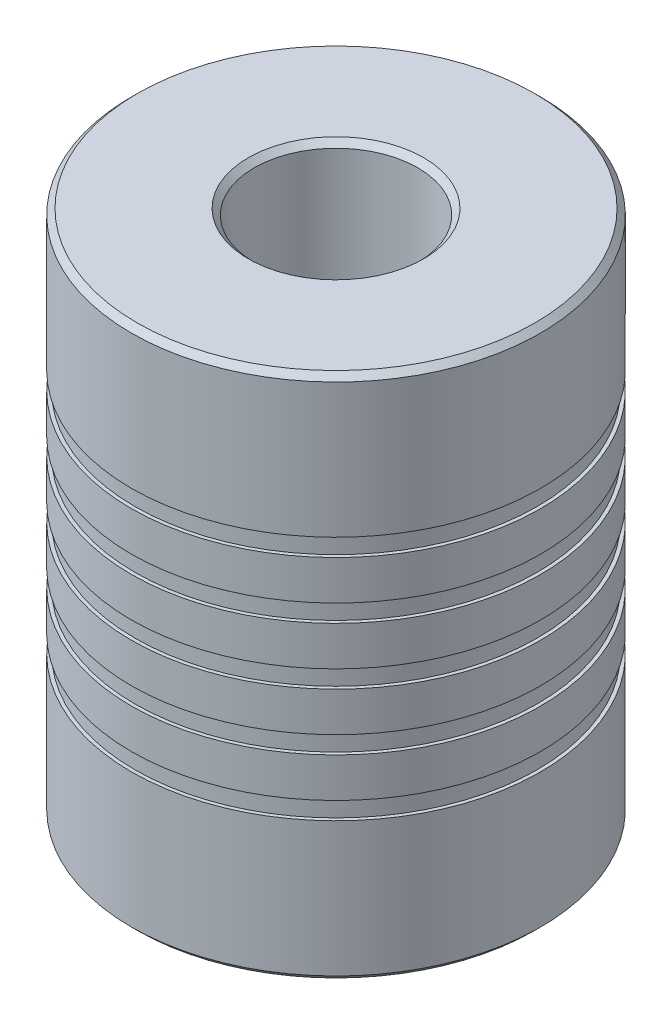
ISO-10303-21;
HEADER;
FILE_DESCRIPTION(('STEP AP214'),'2;1');
FILE_NAME('part.step','',(''),(''),'','','');
FILE_SCHEMA(('AUTOMOTIVE_DESIGN { 1 0 10303 214 1 1 1 1 }'));
ENDSEC;
DATA;
#1=APPLICATION_CONTEXT('core data for automotive mechanical design processes');
#2=APPLICATION_PROTOCOL_DEFINITION('international standard','automotive_design',2000,#1);
#3=PRODUCT_CONTEXT('',#1,'mechanical');
#4=PRODUCT('Part','Part','',(#3));
#5=PRODUCT_RELATED_PRODUCT_CATEGORY('part','',(#4));
#6=PRODUCT_DEFINITION_FORMATION('','',#4);
#7=PRODUCT_DEFINITION_CONTEXT('part definition',#1,'design');
#8=PRODUCT_DEFINITION('design','',#6,#7);
#9=PRODUCT_DEFINITION_SHAPE('','',#8);
#10=(LENGTH_UNIT() NAMED_UNIT(*) SI_UNIT(.MILLI.,.METRE.));
#11=(NAMED_UNIT(*) PLANE_ANGLE_UNIT() SI_UNIT($,.RADIAN.));
#12=(NAMED_UNIT(*) SI_UNIT($,.STERADIAN.) SOLID_ANGLE_UNIT());
#13=UNCERTAINTY_MEASURE_WITH_UNIT(LENGTH_MEASURE(1.E-05),#10,'distance_accuracy_value','');
#14=(GEOMETRIC_REPRESENTATION_CONTEXT(3) GLOBAL_UNCERTAINTY_ASSIGNED_CONTEXT((#13)) GLOBAL_UNIT_ASSIGNED_CONTEXT((#10,
#11,#12)) REPRESENTATION_CONTEXT('',''));
#15=CARTESIAN_POINT('',(0.,0.,0.));
#16=DIRECTION('',(0.,0.,1.));
#17=DIRECTION('',(1.,0.,0.));
#18=AXIS2_PLACEMENT_3D('',#15,#16,#17);
#19=CARTESIAN_POINT('',(0.,53.6510347798851,0.));
#20=DIRECTION('',(0.,1.,0.));
#21=DIRECTION('',(0.,0.,1.));
#22=AXIS2_PLACEMENT_3D('',#19,#20,#21);
#23=CYLINDRICAL_SURFACE('',#22,7.);
#24=CARTESIAN_POINT('',(0.,-22.,0.));
#25=DIRECTION('',(0.,1.,0.));
#26=DIRECTION('',(0.,0.,1.));
#27=AXIS2_PLACEMENT_3D('',#24,#25,#26);
#28=CIRCLE('',#27,7.);
#29=CARTESIAN_POINT('',(0.,-22.,7.));
#30=VERTEX_POINT('',#29);
#31=EDGE_CURVE('E65',#30,#30,#28,.F.);
#32=ORIENTED_EDGE('',*,*,#31,.T.);
#33=EDGE_LOOP('',(#32));
#34=FACE_BOUND('',#33,.T.);
#35=CARTESIAN_POINT('',(2.22044604925031E-13,22.,0.));
#36=DIRECTION('',(0.,-1.,0.));
#37=DIRECTION('',(0.,0.,-1.));
#38=AXIS2_PLACEMENT_3D('',#35,#36,#37);
#39=CIRCLE('',#38,7.);
#40=CARTESIAN_POINT('',(2.21656026866413E-13,22.,-7.));
#41=VERTEX_POINT('',#40);
#42=EDGE_CURVE('E68',#41,#41,#39,.F.);
#43=ORIENTED_EDGE('',*,*,#42,.T.);
#44=EDGE_LOOP('',(#43));
#45=FACE_BOUND('',#44,.T.);
#46=ADVANCED_FACE('F45',(#34,#45),#23,.F.);
#47=CARTESIAN_POINT('',(-7.00000000000001,-22.5,0.));
#48=DIRECTION('',(0.,1.,0.));
#49=DIRECTION('',(0.,0.,1.));
#50=AXIS2_PLACEMENT_3D('',#47,#48,#49);
#51=PLANE('',#50);
#52=CARTESIAN_POINT('',(0.,-22.5,0.));
#53=DIRECTION('',(0.,1.,0.));
#54=DIRECTION('',(0.,0.,1.));
#55=AXIS2_PLACEMENT_3D('',#52,#53,#54);
#56=CIRCLE('',#55,7.50000000000002);
#57=CARTESIAN_POINT('',(0.,-22.5,7.50000000000002));
#58=VERTEX_POINT('',#57);
#59=EDGE_CURVE('E71',#58,#58,#56,.T.);
#60=ORIENTED_EDGE('',*,*,#59,.T.);
#61=EDGE_LOOP('',(#60));
#62=FACE_BOUND('',#61,.T.);
#63=CARTESIAN_POINT('',(0.,-22.5,0.));
#64=DIRECTION('',(0.,1.,0.));
#65=DIRECTION('',(0.,0.,1.));
#66=AXIS2_PLACEMENT_3D('',#63,#64,#65);
#67=CIRCLE('',#66,17.);
#68=CARTESIAN_POINT('',(0.,-22.5,17.));
#69=VERTEX_POINT('',#68);
#70=EDGE_CURVE('E74',#69,#69,#67,.F.);
#71=ORIENTED_EDGE('',*,*,#70,.T.);
#72=EDGE_LOOP('',(#71));
#73=FACE_BOUND('',#72,.T.);
#74=ADVANCED_FACE('F256',(#62,#73),#51,.F.);
#75=CARTESIAN_POINT('',(0.,53.6510347798851,0.));
#76=DIRECTION('',(0.,1.,0.));
#77=DIRECTION('',(0.,0.,1.));
#78=AXIS2_PLACEMENT_3D('',#75,#76,#77);
#79=CYLINDRICAL_SURFACE('',#78,17.5);
#80=CARTESIAN_POINT('',(0.,-22.,0.));
#81=DIRECTION('',(0.,1.,0.));
#82=DIRECTION('',(0.,0.,1.));
#83=AXIS2_PLACEMENT_3D('',#80,#81,#82);
#84=CIRCLE('',#83,17.5);
#85=CARTESIAN_POINT('',(0.,-22.,17.5));
#86=VERTEX_POINT('',#85);
#87=EDGE_CURVE('E60',#86,#86,#84,.T.);
#88=ORIENTED_EDGE('',*,*,#87,.T.);
#89=EDGE_LOOP('',(#88));
#90=FACE_BOUND('',#89,.T.);
#91=CARTESIAN_POINT('',(0.,-10.5,0.));
#92=DIRECTION('',(0.,1.,0.));
#93=DIRECTION('',(0.,0.,1.));
#94=AXIS2_PLACEMENT_3D('',#91,#92,#93);
#95=CIRCLE('',#94,17.5);
#96=CARTESIAN_POINT('',(0.,-10.5,17.5));
#97=VERTEX_POINT('',#96);
#98=EDGE_CURVE('E77',#97,#97,#95,.T.);
#99=ORIENTED_EDGE('',*,*,#98,.F.);
#100=EDGE_LOOP('',(#99));
#101=FACE_BOUND('',#100,.T.);
#102=ADVANCED_FACE('F251',(#90,#101),#79,.T.);
#103=CARTESIAN_POINT('',(-17.5000000000002,-10.5,1.94289029309402E-13));
#104=DIRECTION('',(0.,-1.,0.));
#105=DIRECTION('',(0.,0.,-1.));
#106=AXIS2_PLACEMENT_3D('',#103,#104,#105);
#107=PLANE('',#106);
#108=CARTESIAN_POINT('',(0.,-10.5,0.));
#109=DIRECTION('',(0.,1.,0.));
#110=DIRECTION('',(0.,0.,1.));
#111=AXIS2_PLACEMENT_3D('',#108,#109,#110);
#112=CIRCLE('',#111,17.2);
#113=CARTESIAN_POINT('',(0.,-10.5,17.2));
#114=VERTEX_POINT('',#113);
#115=EDGE_CURVE('E80',#114,#114,#112,.T.);
#116=ORIENTED_EDGE('',*,*,#115,.F.);
#117=EDGE_LOOP('',(#116));
#118=FACE_BOUND('',#117,.T.);
#119=ORIENTED_EDGE('',*,*,#98,.T.);
#120=EDGE_LOOP('',(#119));
#121=FACE_BOUND('',#120,.T.);
#122=ADVANCED_FACE('F245',(#118,#121),#107,.F.);
#123=CARTESIAN_POINT('',(0.,53.6510347798851,0.));
#124=DIRECTION('',(0.,1.,0.));
#125=DIRECTION('',(0.,0.,1.));
#126=AXIS2_PLACEMENT_3D('',#123,#124,#125);
#127=CYLINDRICAL_SURFACE('',#126,17.2);
#128=CARTESIAN_POINT('',(0.,-9.00000000000001,0.));
#129=DIRECTION('',(0.,1.,0.));
#130=DIRECTION('',(0.,0.,1.));
#131=AXIS2_PLACEMENT_3D('',#128,#129,#130);
#132=CIRCLE('',#131,17.2);
#133=CARTESIAN_POINT('',(0.,-9.00000000000001,17.2));
#134=VERTEX_POINT('',#133);
#135=EDGE_CURVE('E83',#134,#134,#132,.T.);
#136=ORIENTED_EDGE('',*,*,#135,.F.);
#137=EDGE_LOOP('',(#136));
#138=FACE_BOUND('',#137,.T.);
#139=ORIENTED_EDGE('',*,*,#115,.T.);
#140=EDGE_LOOP('',(#139));
#141=FACE_BOUND('',#140,.T.);
#142=ADVANCED_FACE('F239',(#138,#141),#127,.T.);
#143=CARTESIAN_POINT('',(-17.2,-8.9999999999999,1.11022302462516E-13));
#144=DIRECTION('',(0.,1.,0.));
#145=DIRECTION('',(0.,0.,1.));
#146=AXIS2_PLACEMENT_3D('',#143,#144,#145);
#147=PLANE('',#146);
#148=CARTESIAN_POINT('',(0.,-9.00000000000001,0.));
#149=DIRECTION('',(0.,1.,0.));
#150=DIRECTION('',(0.,0.,1.));
#151=AXIS2_PLACEMENT_3D('',#148,#149,#150);
#152=CIRCLE('',#151,17.5);
#153=CARTESIAN_POINT('',(0.,-9.00000000000001,17.5));
#154=VERTEX_POINT('',#153);
#155=EDGE_CURVE('E86',#154,#154,#152,.T.);
#156=ORIENTED_EDGE('',*,*,#155,.F.);
#157=EDGE_LOOP('',(#156));
#158=FACE_BOUND('',#157,.T.);
#159=ORIENTED_EDGE('',*,*,#135,.T.);
#160=EDGE_LOOP('',(#159));
#161=FACE_BOUND('',#160,.T.);
#162=ADVANCED_FACE('F233',(#158,#161),#147,.F.);
#163=CARTESIAN_POINT('',(0.,53.6510347798851,0.));
#164=DIRECTION('',(0.,1.,0.));
#165=DIRECTION('',(0.,0.,1.));
#166=AXIS2_PLACEMENT_3D('',#163,#164,#165);
#167=CYLINDRICAL_SURFACE('',#166,17.5);
#168=CARTESIAN_POINT('',(0.,-5.62499999999999,0.));
#169=DIRECTION('',(0.,1.,0.));
#170=DIRECTION('',(0.,0.,1.));
#171=AXIS2_PLACEMENT_3D('',#168,#169,#170);
#172=CIRCLE('',#171,17.5);
#173=CARTESIAN_POINT('',(0.,-5.62499999999999,17.5));
#174=VERTEX_POINT('',#173);
#175=EDGE_CURVE('E89',#174,#174,#172,.T.);
#176=ORIENTED_EDGE('',*,*,#175,.F.);
#177=EDGE_LOOP('',(#176));
#178=FACE_BOUND('',#177,.T.);
#179=ORIENTED_EDGE('',*,*,#155,.T.);
#180=EDGE_LOOP('',(#179));
#181=FACE_BOUND('',#180,.T.);
#182=ADVANCED_FACE('F227',(#178,#181),#167,.T.);
#183=CARTESIAN_POINT('',(-17.5000000000002,-5.62499999999999,1.11022302462516E-13));
#184=DIRECTION('',(0.,-1.,0.));
#185=DIRECTION('',(0.,0.,-1.));
#186=AXIS2_PLACEMENT_3D('',#183,#184,#185);
#187=PLANE('',#186);
#188=CARTESIAN_POINT('',(0.,-5.62499999999999,0.));
#189=DIRECTION('',(0.,1.,0.));
#190=DIRECTION('',(0.,0.,1.));
#191=AXIS2_PLACEMENT_3D('',#188,#189,#190);
#192=CIRCLE('',#191,17.2);
#193=CARTESIAN_POINT('',(0.,-5.62499999999999,17.2));
#194=VERTEX_POINT('',#193);
#195=EDGE_CURVE('E92',#194,#194,#192,.T.);
#196=ORIENTED_EDGE('',*,*,#195,.F.);
#197=EDGE_LOOP('',(#196));
#198=FACE_BOUND('',#197,.T.);
#199=ORIENTED_EDGE('',*,*,#175,.T.);
#200=EDGE_LOOP('',(#199));
#201=FACE_BOUND('',#200,.T.);
#202=ADVANCED_FACE('F221',(#198,#201),#187,.F.);
#203=CARTESIAN_POINT('',(0.,53.6510347798851,0.));
#204=DIRECTION('',(0.,1.,0.));
#205=DIRECTION('',(0.,0.,1.));
#206=AXIS2_PLACEMENT_3D('',#203,#204,#205);
#207=CYLINDRICAL_SURFACE('',#206,17.2);
#208=CARTESIAN_POINT('',(0.,-4.12499999999993,0.));
#209=DIRECTION('',(0.,1.,0.));
#210=DIRECTION('',(0.,0.,1.));
#211=AXIS2_PLACEMENT_3D('',#208,#209,#210);
#212=CIRCLE('',#211,17.2);
#213=CARTESIAN_POINT('',(0.,-4.12499999999993,17.2));
#214=VERTEX_POINT('',#213);
#215=EDGE_CURVE('E95',#214,#214,#212,.T.);
#216=ORIENTED_EDGE('',*,*,#215,.F.);
#217=EDGE_LOOP('',(#216));
#218=FACE_BOUND('',#217,.T.);
#219=ORIENTED_EDGE('',*,*,#195,.T.);
#220=EDGE_LOOP('',(#219));
#221=FACE_BOUND('',#220,.T.);
#222=ADVANCED_FACE('F215',(#218,#221),#207,.T.);
#223=CARTESIAN_POINT('',(-17.2,-4.12500000000005,1.11022302462516E-13));
#224=DIRECTION('',(0.,1.,0.));
#225=DIRECTION('',(0.,0.,1.));
#226=AXIS2_PLACEMENT_3D('',#223,#224,#225);
#227=PLANE('',#226);
#228=CARTESIAN_POINT('',(0.,-4.12499999999993,0.));
#229=DIRECTION('',(0.,1.,0.));
#230=DIRECTION('',(0.,0.,1.));
#231=AXIS2_PLACEMENT_3D('',#228,#229,#230);
#232=CIRCLE('',#231,17.5);
#233=CARTESIAN_POINT('',(0.,-4.12499999999993,17.5));
#234=VERTEX_POINT('',#233);
#235=EDGE_CURVE('E98',#234,#234,#232,.T.);
#236=ORIENTED_EDGE('',*,*,#235,.F.);
#237=EDGE_LOOP('',(#236));
#238=FACE_BOUND('',#237,.T.);
#239=ORIENTED_EDGE('',*,*,#215,.T.);
#240=EDGE_LOOP('',(#239));
#241=FACE_BOUND('',#240,.T.);
#242=ADVANCED_FACE('F209',(#238,#241),#227,.F.);
#243=CARTESIAN_POINT('',(0.,53.6510347798851,0.));
#244=DIRECTION('',(0.,1.,0.));
#245=DIRECTION('',(0.,0.,1.));
#246=AXIS2_PLACEMENT_3D('',#243,#244,#245);
#247=CYLINDRICAL_SURFACE('',#246,17.5);
#248=CARTESIAN_POINT('',(0.,-0.750000000000028,0.));
#249=DIRECTION('',(0.,1.,0.));
#250=DIRECTION('',(0.,0.,1.));
#251=AXIS2_PLACEMENT_3D('',#248,#249,#250);
#252=CIRCLE('',#251,17.5);
#253=CARTESIAN_POINT('',(0.,-0.750000000000028,17.5));
#254=VERTEX_POINT('',#253);
#255=EDGE_CURVE('E101',#254,#254,#252,.T.);
#256=ORIENTED_EDGE('',*,*,#255,.F.);
#257=EDGE_LOOP('',(#256));
#258=FACE_BOUND('',#257,.T.);
#259=ORIENTED_EDGE('',*,*,#235,.T.);
#260=EDGE_LOOP('',(#259));
#261=FACE_BOUND('',#260,.T.);
#262=ADVANCED_FACE('F203',(#258,#261),#247,.T.);
#263=CARTESIAN_POINT('',(-17.5000000000002,-0.750000000000028,1.94289029309402E-13));
#264=DIRECTION('',(0.,-1.,0.));
#265=DIRECTION('',(0.,0.,-1.));
#266=AXIS2_PLACEMENT_3D('',#263,#264,#265);
#267=PLANE('',#266);
#268=CARTESIAN_POINT('',(0.,-0.750000000000028,0.));
#269=DIRECTION('',(0.,1.,0.));
#270=DIRECTION('',(0.,0.,1.));
#271=AXIS2_PLACEMENT_3D('',#268,#269,#270);
#272=CIRCLE('',#271,17.2);
#273=CARTESIAN_POINT('',(0.,-0.750000000000028,17.2));
#274=VERTEX_POINT('',#273);
#275=EDGE_CURVE('E104',#274,#274,#272,.T.);
#276=ORIENTED_EDGE('',*,*,#275,.F.);
#277=EDGE_LOOP('',(#276));
#278=FACE_BOUND('',#277,.T.);
#279=ORIENTED_EDGE('',*,*,#255,.T.);
#280=EDGE_LOOP('',(#279));
#281=FACE_BOUND('',#280,.T.);
#282=ADVANCED_FACE('F197',(#278,#281),#267,.F.);
#283=CARTESIAN_POINT('',(0.,53.6510347798851,0.));
#284=DIRECTION('',(0.,1.,0.));
#285=DIRECTION('',(0.,0.,1.));
#286=AXIS2_PLACEMENT_3D('',#283,#284,#285);
#287=CYLINDRICAL_SURFACE('',#286,17.2);
#288=CARTESIAN_POINT('',(0.,0.750000000000028,0.));
#289=DIRECTION('',(0.,1.,0.));
#290=DIRECTION('',(0.,0.,1.));
#291=AXIS2_PLACEMENT_3D('',#288,#289,#290);
#292=CIRCLE('',#291,17.2);
#293=CARTESIAN_POINT('',(0.,0.750000000000029,17.2));
#294=VERTEX_POINT('',#293);
#295=EDGE_CURVE('E107',#294,#294,#292,.T.);
#296=ORIENTED_EDGE('',*,*,#295,.F.);
#297=EDGE_LOOP('',(#296));
#298=FACE_BOUND('',#297,.T.);
#299=ORIENTED_EDGE('',*,*,#275,.T.);
#300=EDGE_LOOP('',(#299));
#301=FACE_BOUND('',#300,.T.);
#302=ADVANCED_FACE('F191',(#298,#301),#287,.T.);
#303=CARTESIAN_POINT('',(-17.5000000000002,0.750000000000028,1.11022302462516E-13));
#304=DIRECTION('',(0.,1.,0.));
#305=DIRECTION('',(0.,0.,1.));
#306=AXIS2_PLACEMENT_3D('',#303,#304,#305);
#307=PLANE('',#306);
#308=CARTESIAN_POINT('',(0.,0.750000000000028,0.));
#309=DIRECTION('',(0.,1.,0.));
#310=DIRECTION('',(0.,0.,1.));
#311=AXIS2_PLACEMENT_3D('',#308,#309,#310);
#312=CIRCLE('',#311,17.5);
#313=CARTESIAN_POINT('',(0.,0.750000000000029,17.5));
#314=VERTEX_POINT('',#313);
#315=EDGE_CURVE('E110',#314,#314,#312,.T.);
#316=ORIENTED_EDGE('',*,*,#315,.F.);
#317=EDGE_LOOP('',(#316));
#318=FACE_BOUND('',#317,.T.);
#319=ORIENTED_EDGE('',*,*,#295,.T.);
#320=EDGE_LOOP('',(#319));
#321=FACE_BOUND('',#320,.T.);
#322=ADVANCED_FACE('F185',(#318,#321),#307,.F.);
#323=CARTESIAN_POINT('',(0.,53.6510347798851,0.));
#324=DIRECTION('',(0.,1.,0.));
#325=DIRECTION('',(0.,0.,1.));
#326=AXIS2_PLACEMENT_3D('',#323,#324,#325);
#327=CYLINDRICAL_SURFACE('',#326,17.5);
#328=CARTESIAN_POINT('',(2.22044604925031E-13,4.12500000000005,0.));
#329=DIRECTION('',(0.,1.,0.));
#330=DIRECTION('',(0.,0.,1.));
#331=AXIS2_PLACEMENT_3D('',#328,#329,#330);
#332=CIRCLE('',#331,17.5);
#333=CARTESIAN_POINT('',(2.23016050071578E-13,4.12500000000005,17.5));
#334=VERTEX_POINT('',#333);
#335=EDGE_CURVE('E113',#334,#334,#332,.T.);
#336=ORIENTED_EDGE('',*,*,#335,.F.);
#337=EDGE_LOOP('',(#336));
#338=FACE_BOUND('',#337,.T.);
#339=ORIENTED_EDGE('',*,*,#315,.T.);
#340=EDGE_LOOP('',(#339));
#341=FACE_BOUND('',#340,.T.);
#342=ADVANCED_FACE('F179',(#338,#341),#327,.T.);
#343=CARTESIAN_POINT('',(-17.1999999999999,4.12499999999993,2.22044604925031E-13));
#344=DIRECTION('',(0.,-1.,0.));
#345=DIRECTION('',(0.,0.,-1.));
#346=AXIS2_PLACEMENT_3D('',#343,#344,#345);
#347=PLANE('',#346);
#348=CARTESIAN_POINT('',(2.22044604925031E-13,4.12500000000005,0.));
#349=DIRECTION('',(0.,1.,0.));
#350=DIRECTION('',(0.,0.,1.));
#351=AXIS2_PLACEMENT_3D('',#348,#349,#350);
#352=CIRCLE('',#351,17.2);
#353=CARTESIAN_POINT('',(2.22999396726209E-13,4.12500000000005,17.2));
#354=VERTEX_POINT('',#353);
#355=EDGE_CURVE('E116',#354,#354,#352,.T.);
#356=ORIENTED_EDGE('',*,*,#355,.F.);
#357=EDGE_LOOP('',(#356));
#358=FACE_BOUND('',#357,.T.);
#359=ORIENTED_EDGE('',*,*,#335,.T.);
#360=EDGE_LOOP('',(#359));
#361=FACE_BOUND('',#360,.T.);
#362=ADVANCED_FACE('F173',(#358,#361),#347,.F.);
#363=CARTESIAN_POINT('',(0.,53.6510347798851,0.));
#364=DIRECTION('',(0.,1.,0.));
#365=DIRECTION('',(0.,0.,1.));
#366=AXIS2_PLACEMENT_3D('',#363,#364,#365);
#367=CYLINDRICAL_SURFACE('',#366,17.2);
#368=CARTESIAN_POINT('',(2.22044604925031E-13,5.62499999999999,0.));
#369=DIRECTION('',(0.,1.,0.));
#370=DIRECTION('',(0.,0.,1.));
#371=AXIS2_PLACEMENT_3D('',#368,#369,#370);
#372=CIRCLE('',#371,17.2);
#373=CARTESIAN_POINT('',(2.22999396726209E-13,5.62499999999999,17.2));
#374=VERTEX_POINT('',#373);
#375=EDGE_CURVE('E119',#374,#374,#372,.T.);
#376=ORIENTED_EDGE('',*,*,#375,.F.);
#377=EDGE_LOOP('',(#376));
#378=FACE_BOUND('',#377,.T.);
#379=ORIENTED_EDGE('',*,*,#355,.T.);
#380=EDGE_LOOP('',(#379));
#381=FACE_BOUND('',#380,.T.);
#382=ADVANCED_FACE('F167',(#378,#381),#367,.T.);
#383=CARTESIAN_POINT('',(-17.5,5.62499999999999,1.38777878078145E-13));
#384=DIRECTION('',(0.,1.,0.));
#385=DIRECTION('',(0.,0.,1.));
#386=AXIS2_PLACEMENT_3D('',#383,#384,#385);
#387=PLANE('',#386);
#388=CARTESIAN_POINT('',(2.22044604925031E-13,5.62499999999999,0.));
#389=DIRECTION('',(0.,1.,0.));
#390=DIRECTION('',(0.,0.,1.));
#391=AXIS2_PLACEMENT_3D('',#388,#389,#390);
#392=CIRCLE('',#391,17.5);
#393=CARTESIAN_POINT('',(2.23016050071578E-13,5.62499999999999,17.5));
#394=VERTEX_POINT('',#393);
#395=EDGE_CURVE('E122',#394,#394,#392,.T.);
#396=ORIENTED_EDGE('',*,*,#395,.F.);
#397=EDGE_LOOP('',(#396));
#398=FACE_BOUND('',#397,.T.);
#399=ORIENTED_EDGE('',*,*,#375,.T.);
#400=EDGE_LOOP('',(#399));
#401=FACE_BOUND('',#400,.T.);
#402=ADVANCED_FACE('F161',(#398,#401),#387,.F.);
#403=CARTESIAN_POINT('',(0.,53.6510347798851,0.));
#404=DIRECTION('',(0.,1.,0.));
#405=DIRECTION('',(0.,0.,1.));
#406=AXIS2_PLACEMENT_3D('',#403,#404,#405);
#407=CYLINDRICAL_SURFACE('',#406,17.5);
#408=CARTESIAN_POINT('',(2.22044604925031E-13,9.00000000000001,0.));
#409=DIRECTION('',(0.,1.,0.));
#410=DIRECTION('',(0.,0.,1.));
#411=AXIS2_PLACEMENT_3D('',#408,#409,#410);
#412=CIRCLE('',#411,17.5);
#413=CARTESIAN_POINT('',(2.23016050071578E-13,9.00000000000001,17.5));
#414=VERTEX_POINT('',#413);
#415=EDGE_CURVE('E125',#414,#414,#412,.T.);
#416=ORIENTED_EDGE('',*,*,#415,.F.);
#417=EDGE_LOOP('',(#416));
#418=FACE_BOUND('',#417,.T.);
#419=ORIENTED_EDGE('',*,*,#395,.T.);
#420=EDGE_LOOP('',(#419));
#421=FACE_BOUND('',#420,.T.);
#422=ADVANCED_FACE('F155',(#418,#421),#407,.T.);
#423=CARTESIAN_POINT('',(-17.2,9.00000000000001,1.11022302462516E-13));
#424=DIRECTION('',(0.,-1.,0.));
#425=DIRECTION('',(0.,0.,-1.));
#426=AXIS2_PLACEMENT_3D('',#423,#424,#425);
#427=PLANE('',#426);
#428=CARTESIAN_POINT('',(2.22044604925031E-13,9.00000000000001,0.));
#429=DIRECTION('',(0.,1.,0.));
#430=DIRECTION('',(0.,0.,1.));
#431=AXIS2_PLACEMENT_3D('',#428,#429,#430);
#432=CIRCLE('',#431,17.2);
#433=CARTESIAN_POINT('',(2.22999396726209E-13,9.00000000000001,17.2));
#434=VERTEX_POINT('',#433);
#435=EDGE_CURVE('E128',#434,#434,#432,.T.);
#436=ORIENTED_EDGE('',*,*,#435,.F.);
#437=EDGE_LOOP('',(#436));
#438=FACE_BOUND('',#437,.T.);
#439=ORIENTED_EDGE('',*,*,#415,.T.);
#440=EDGE_LOOP('',(#439));
#441=FACE_BOUND('',#440,.T.);
#442=ADVANCED_FACE('F149',(#438,#441),#427,.F.);
#443=CARTESIAN_POINT('',(0.,53.6510347798851,0.));
#444=DIRECTION('',(0.,1.,0.));
#445=DIRECTION('',(0.,0.,1.));
#446=AXIS2_PLACEMENT_3D('',#443,#444,#445);
#447=CYLINDRICAL_SURFACE('',#446,17.2);
#448=CARTESIAN_POINT('',(2.23779328401008E-13,10.5,0.));
#449=DIRECTION('',(0.,1.,0.));
#450=DIRECTION('',(0.,0.,1.));
#451=AXIS2_PLACEMENT_3D('',#448,#449,#450);
#452=CIRCLE('',#451,17.2);
#453=CARTESIAN_POINT('',(2.24734120202186E-13,10.5,17.2));
#454=VERTEX_POINT('',#453);
#455=EDGE_CURVE('E131',#454,#454,#452,.T.);
#456=ORIENTED_EDGE('',*,*,#455,.F.);
#457=EDGE_LOOP('',(#456));
#458=FACE_BOUND('',#457,.T.);
#459=ORIENTED_EDGE('',*,*,#435,.T.);
#460=EDGE_LOOP('',(#459));
#461=FACE_BOUND('',#460,.T.);
#462=ADVANCED_FACE('F143',(#458,#461),#447,.T.);
#463=CARTESIAN_POINT('',(-17.5,10.5,1.11022302462516E-13));
#464=DIRECTION('',(0.,1.,0.));
#465=DIRECTION('',(0.,0.,1.));
#466=AXIS2_PLACEMENT_3D('',#463,#464,#465);
#467=PLANE('',#466);
#468=CARTESIAN_POINT('',(2.23779328401008E-13,10.5,0.));
#469=DIRECTION('',(0.,1.,0.));
#470=DIRECTION('',(0.,0.,1.));
#471=AXIS2_PLACEMENT_3D('',#468,#469,#470);
#472=CIRCLE('',#471,17.5);
#473=CARTESIAN_POINT('',(2.24750773547555E-13,10.5,17.5));
#474=VERTEX_POINT('',#473);
#475=EDGE_CURVE('E134',#474,#474,#472,.T.);
#476=ORIENTED_EDGE('',*,*,#475,.F.);
#477=EDGE_LOOP('',(#476));
#478=FACE_BOUND('',#477,.T.);
#479=ORIENTED_EDGE('',*,*,#455,.T.);
#480=EDGE_LOOP('',(#479));
#481=FACE_BOUND('',#480,.T.);
#482=ADVANCED_FACE('F140',(#478,#481),#467,.F.);
#483=CARTESIAN_POINT('',(0.,53.6510347798851,0.));
#484=DIRECTION('',(0.,1.,0.));
#485=DIRECTION('',(0.,0.,1.));
#486=AXIS2_PLACEMENT_3D('',#483,#484,#485);
#487=CYLINDRICAL_SURFACE('',#486,17.5);
#488=CARTESIAN_POINT('',(2.22044604925031E-13,22.,0.));
#489=DIRECTION('',(0.,-1.,0.));
#490=DIRECTION('',(0.,0.,-1.));
#491=AXIS2_PLACEMENT_3D('',#488,#489,#490);
#492=CIRCLE('',#491,17.5);
#493=CARTESIAN_POINT('',(2.21073159778484E-13,22.,-17.5));
#494=VERTEX_POINT('',#493);
#495=EDGE_CURVE('E12',#494,#494,#492,.T.);
#496=ORIENTED_EDGE('',*,*,#495,.T.);
#497=EDGE_LOOP('',(#496));
#498=FACE_BOUND('',#497,.T.);
#499=ORIENTED_EDGE('',*,*,#475,.T.);
#500=EDGE_LOOP('',(#499));
#501=FACE_BOUND('',#500,.T.);
#502=ADVANCED_FACE('F138',(#498,#501),#487,.T.);
#503=CARTESIAN_POINT('',(-7.00000000000001,22.5,0.));
#504=DIRECTION('',(0.,-1.,0.));
#505=DIRECTION('',(0.,0.,-1.));
#506=AXIS2_PLACEMENT_3D('',#503,#504,#505);
#507=PLANE('',#506);
#508=CARTESIAN_POINT('',(2.22044604925031E-13,22.5,0.));
#509=DIRECTION('',(0.,-1.,0.));
#510=DIRECTION('',(0.,0.,-1.));
#511=AXIS2_PLACEMENT_3D('',#508,#509,#510);
#512=CIRCLE('',#511,7.50000000000003);
#513=CARTESIAN_POINT('',(2.21628271290797E-13,22.5,-7.50000000000003));
#514=VERTEX_POINT('',#513);
#515=EDGE_CURVE('E52',#514,#514,#512,.T.);
#516=ORIENTED_EDGE('',*,*,#515,.T.);
#517=EDGE_LOOP('',(#516));
#518=FACE_BOUND('',#517,.T.);
#519=CARTESIAN_POINT('',(2.22044604925031E-13,22.5,0.));
#520=DIRECTION('',(0.,-1.,0.));
#521=DIRECTION('',(0.,0.,-1.));
#522=AXIS2_PLACEMENT_3D('',#519,#520,#521);
#523=CIRCLE('',#522,17.);
#524=CARTESIAN_POINT('',(2.211009153541E-13,22.5,-17.));
#525=VERTEX_POINT('',#524);
#526=EDGE_CURVE('E56',#525,#525,#523,.F.);
#527=ORIENTED_EDGE('',*,*,#526,.T.);
#528=EDGE_LOOP('',(#527));
#529=FACE_BOUND('',#528,.T.);
#530=ADVANCED_FACE('F275',(#518,#529),#507,.F.);
#531=CARTESIAN_POINT('',(0.,-22.5,0.));
#532=DIRECTION('',(0.,-1.,0.));
#533=DIRECTION('',(0.,0.,-1.));
#534=AXIS2_PLACEMENT_3D('',#531,#532,#533);
#535=CONICAL_SURFACE('',#534,7.50000000000001,0.785398163397457);
#536=ORIENTED_EDGE('',*,*,#31,.F.);
#537=EDGE_LOOP('',(#536));
#538=FACE_BOUND('',#537,.T.);
#539=ORIENTED_EDGE('',*,*,#59,.F.);
#540=EDGE_LOOP('',(#539));
#541=FACE_BOUND('',#540,.T.);
#542=ADVANCED_FACE('F271',(#538,#541),#535,.F.);
#543=CARTESIAN_POINT('',(0.,-22.,0.));
#544=DIRECTION('',(0.,1.,0.));
#545=DIRECTION('',(0.,0.,1.));
#546=AXIS2_PLACEMENT_3D('',#543,#544,#545);
#547=CONICAL_SURFACE('',#546,17.5,0.785398163397455);
#548=ORIENTED_EDGE('',*,*,#70,.F.);
#549=EDGE_LOOP('',(#548));
#550=FACE_BOUND('',#549,.T.);
#551=ORIENTED_EDGE('',*,*,#87,.F.);
#552=EDGE_LOOP('',(#551));
#553=FACE_BOUND('',#552,.T.);
#554=ADVANCED_FACE('F274',(#550,#553),#547,.T.);
#555=CARTESIAN_POINT('',(2.22044604925031E-13,22.,0.));
#556=DIRECTION('',(0.,1.,0.));
#557=DIRECTION('',(0.,0.,1.));
#558=AXIS2_PLACEMENT_3D('',#555,#556,#557);
#559=CONICAL_SURFACE('',#558,7.,0.785398163397458);
#560=ORIENTED_EDGE('',*,*,#515,.F.);
#561=EDGE_LOOP('',(#560));
#562=FACE_BOUND('',#561,.T.);
#563=ORIENTED_EDGE('',*,*,#42,.F.);
#564=EDGE_LOOP('',(#563));
#565=FACE_BOUND('',#564,.T.);
#566=ADVANCED_FACE('F278',(#562,#565),#559,.F.);
#567=CARTESIAN_POINT('',(2.22044604925031E-13,22.5,0.));
#568=DIRECTION('',(0.,-1.,0.));
#569=DIRECTION('',(0.,0.,-1.));
#570=AXIS2_PLACEMENT_3D('',#567,#568,#569);
#571=CONICAL_SURFACE('',#570,17.,0.785398163397438);
#572=ORIENTED_EDGE('',*,*,#495,.F.);
#573=EDGE_LOOP('',(#572));
#574=FACE_BOUND('',#573,.T.);
#575=ORIENTED_EDGE('',*,*,#526,.F.);
#576=EDGE_LOOP('',(#575));
#577=FACE_BOUND('',#576,.T.);
#578=ADVANCED_FACE('F47',(#574,#577),#571,.T.);
#579=CLOSED_SHELL('',(#46,#74,#102,#122,#142,#162,#182,#202,#222,#242,#262,#282,#302,#322,#342,
#362,#382,#402,#422,#442,#462,#482,#502,#530,#542,#554,#566,#578));
#580=MANIFOLD_SOLID_BREP('B2',#579);
#581=ADVANCED_BREP_SHAPE_REPRESENTATION('',(#18,#580),#14);
#582=SHAPE_DEFINITION_REPRESENTATION(#9,#581);
ENDSEC;
END-ISO-10303-21;
